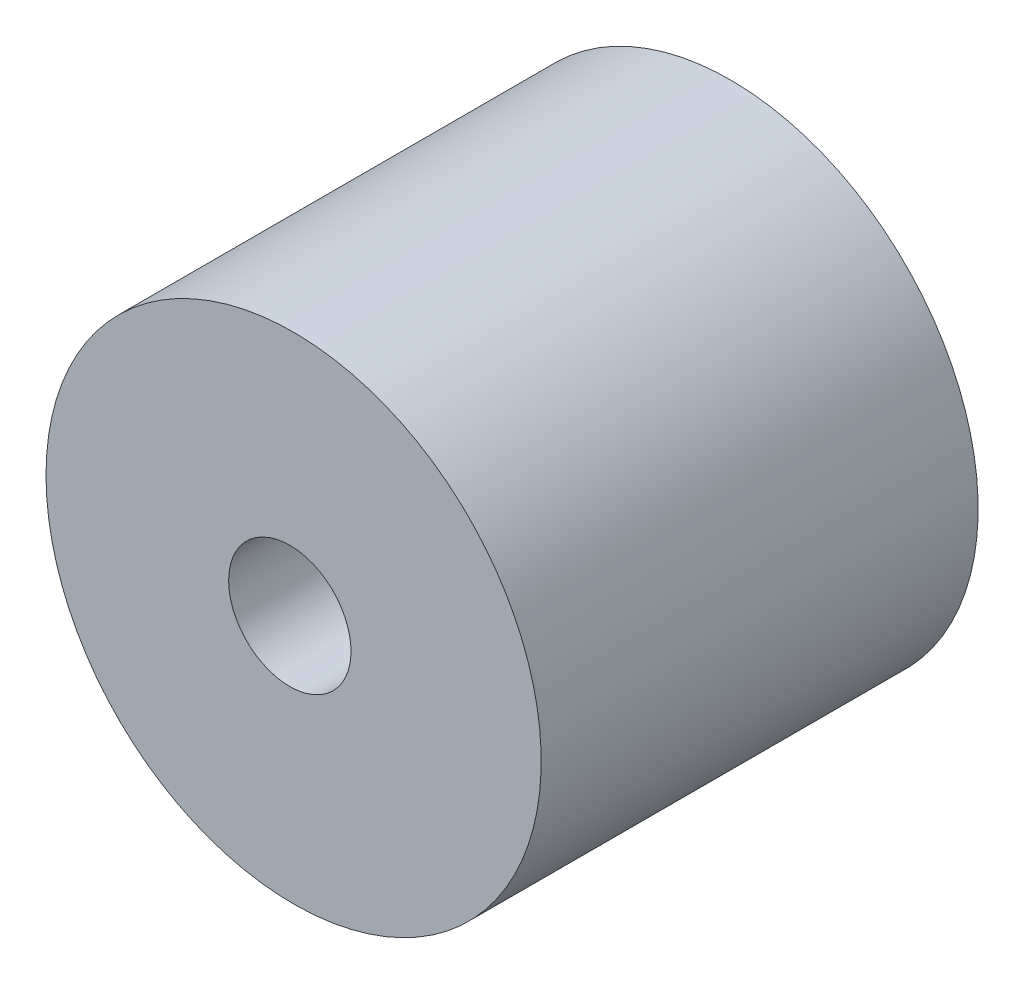
ISO-10303-21;
HEADER;
FILE_DESCRIPTION(('STEP AP214'),'2;1');
FILE_NAME('part.step','',(''),(''),'','','');
FILE_SCHEMA(('AUTOMOTIVE_DESIGN { 1 0 10303 214 1 1 1 1 }'));
ENDSEC;
DATA;
#1=APPLICATION_CONTEXT('core data for automotive mechanical design processes');
#2=APPLICATION_PROTOCOL_DEFINITION('international standard','automotive_design',2000,#1);
#3=PRODUCT_CONTEXT('',#1,'mechanical');
#4=PRODUCT('Part','Part','',(#3));
#5=PRODUCT_RELATED_PRODUCT_CATEGORY('part','',(#4));
#6=PRODUCT_DEFINITION_FORMATION('','',#4);
#7=PRODUCT_DEFINITION_CONTEXT('part definition',#1,'design');
#8=PRODUCT_DEFINITION('design','',#6,#7);
#9=PRODUCT_DEFINITION_SHAPE('','',#8);
#10=(LENGTH_UNIT() NAMED_UNIT(*) SI_UNIT(.MILLI.,.METRE.));
#11=(NAMED_UNIT(*) PLANE_ANGLE_UNIT() SI_UNIT($,.RADIAN.));
#12=(NAMED_UNIT(*) SI_UNIT($,.STERADIAN.) SOLID_ANGLE_UNIT());
#13=UNCERTAINTY_MEASURE_WITH_UNIT(LENGTH_MEASURE(1.E-05),#10,'distance_accuracy_value','');
#14=(GEOMETRIC_REPRESENTATION_CONTEXT(3) GLOBAL_UNCERTAINTY_ASSIGNED_CONTEXT((#13)) GLOBAL_UNIT_ASSIGNED_CONTEXT((#10,
#11,#12)) REPRESENTATION_CONTEXT('',''));
#15=CARTESIAN_POINT('',(0.,0.,0.));
#16=DIRECTION('',(0.,0.,1.));
#17=DIRECTION('',(1.,0.,0.));
#18=AXIS2_PLACEMENT_3D('',#15,#16,#17);
#19=CARTESIAN_POINT('',(0.165429311437038,0.,19.05));
#20=DIRECTION('',(0.,0.,1.));
#21=DIRECTION('',(1.,0.,0.));
#22=AXIS2_PLACEMENT_3D('',#19,#20,#21);
#23=PLANE('',#22);
#24=CARTESIAN_POINT('',(0.165429311437038,0.,19.05));
#25=DIRECTION('',(0.,0.,1.));
#26=DIRECTION('',(1.,0.,0.));
#27=AXIS2_PLACEMENT_3D('',#24,#25,#26);
#28=CIRCLE('',#27,10.795);
#29=CARTESIAN_POINT('',(-10.629570688563,0.,19.05));
#30=VERTEX_POINT('',#29);
#31=EDGE_CURVE('E10',#30,#30,#28,.T.);
#32=ORIENTED_EDGE('',*,*,#31,.T.);
#33=EDGE_LOOP('',(#32));
#34=FACE_BOUND('',#33,.T.);
#35=CARTESIAN_POINT('',(0.,0.,19.05));
#36=DIRECTION('',(0.,0.,1.));
#37=DIRECTION('',(1.,0.,0.));
#38=AXIS2_PLACEMENT_3D('',#35,#36,#37);
#39=CIRCLE('',#38,2.667);
#40=CARTESIAN_POINT('',(-2.667,0.,19.05));
#41=VERTEX_POINT('',#40);
#42=EDGE_CURVE('E46',#41,#41,#39,.T.);
#43=ORIENTED_EDGE('',*,*,#42,.F.);
#44=EDGE_LOOP('',(#43));
#45=FACE_BOUND('',#44,.T.);
#46=ADVANCED_FACE('F35',(#34,#45),#23,.T.);
#47=CARTESIAN_POINT('',(0.165429311437038,0.,0.));
#48=DIRECTION('',(0.,0.,1.));
#49=DIRECTION('',(1.,0.,0.));
#50=AXIS2_PLACEMENT_3D('',#47,#48,#49);
#51=PLANE('',#50);
#52=CARTESIAN_POINT('',(0.165429311437038,0.,0.));
#53=DIRECTION('',(0.,0.,1.));
#54=DIRECTION('',(1.,0.,0.));
#55=AXIS2_PLACEMENT_3D('',#52,#53,#54);
#56=CIRCLE('',#55,10.795);
#57=CARTESIAN_POINT('',(-10.629570688563,0.,0.));
#58=VERTEX_POINT('',#57);
#59=EDGE_CURVE('E39',#58,#58,#56,.T.);
#60=ORIENTED_EDGE('',*,*,#59,.F.);
#61=EDGE_LOOP('',(#60));
#62=FACE_BOUND('',#61,.T.);
#63=CARTESIAN_POINT('',(0.,0.,0.));
#64=DIRECTION('',(0.,0.,1.));
#65=DIRECTION('',(1.,0.,0.));
#66=AXIS2_PLACEMENT_3D('',#63,#64,#65);
#67=CIRCLE('',#66,2.667);
#68=CARTESIAN_POINT('',(-2.667,0.,0.));
#69=VERTEX_POINT('',#68);
#70=EDGE_CURVE('E48',#69,#69,#67,.T.);
#71=ORIENTED_EDGE('',*,*,#70,.T.);
#72=EDGE_LOOP('',(#71));
#73=FACE_BOUND('',#72,.T.);
#74=ADVANCED_FACE('F58',(#62,#73),#51,.F.);
#75=CARTESIAN_POINT('',(0.165429311437038,0.,19.05));
#76=DIRECTION('',(0.,0.,-1.));
#77=DIRECTION('',(-1.,0.,0.));
#78=AXIS2_PLACEMENT_3D('',#75,#76,#77);
#79=CYLINDRICAL_SURFACE('',#78,10.795);
#80=CARTESIAN_POINT('',(-10.629570688563,0.,19.05));
#81=CARTESIAN_POINT('',(-10.629570688563,0.,18.8515625));
#82=CARTESIAN_POINT('',(-10.629570688563,0.,18.653125));
#83=CARTESIAN_POINT('',(-10.629570688563,0.,18.25625));
#84=CARTESIAN_POINT('',(-10.629570688563,0.,18.0578125));
#85=CARTESIAN_POINT('',(-10.629570688563,0.,17.6609375));
#86=CARTESIAN_POINT('',(-10.629570688563,0.,17.4625));
#87=CARTESIAN_POINT('',(-10.629570688563,0.,17.065625));
#88=CARTESIAN_POINT('',(-10.629570688563,0.,16.8671875));
#89=CARTESIAN_POINT('',(-10.629570688563,0.,16.4703125));
#90=CARTESIAN_POINT('',(-10.629570688563,0.,16.271875));
#91=CARTESIAN_POINT('',(-10.629570688563,0.,15.875));
#92=CARTESIAN_POINT('',(-10.629570688563,0.,15.6765625));
#93=CARTESIAN_POINT('',(-10.629570688563,0.,15.2796875));
#94=CARTESIAN_POINT('',(-10.629570688563,0.,15.08125));
#95=CARTESIAN_POINT('',(-10.629570688563,0.,14.684375));
#96=CARTESIAN_POINT('',(-10.629570688563,0.,14.4859375));
#97=CARTESIAN_POINT('',(-10.629570688563,0.,14.0890625));
#98=CARTESIAN_POINT('',(-10.629570688563,0.,13.890625));
#99=CARTESIAN_POINT('',(-10.629570688563,0.,13.49375));
#100=CARTESIAN_POINT('',(-10.629570688563,0.,13.2953125));
#101=CARTESIAN_POINT('',(-10.629570688563,0.,12.8984375));
#102=CARTESIAN_POINT('',(-10.629570688563,0.,12.7));
#103=CARTESIAN_POINT('',(-10.629570688563,0.,12.303125));
#104=CARTESIAN_POINT('',(-10.629570688563,0.,12.1046875));
#105=CARTESIAN_POINT('',(-10.629570688563,0.,11.7078125));
#106=CARTESIAN_POINT('',(-10.629570688563,0.,11.509375));
#107=CARTESIAN_POINT('',(-10.629570688563,0.,11.1125));
#108=CARTESIAN_POINT('',(-10.629570688563,0.,10.9140625));
#109=CARTESIAN_POINT('',(-10.629570688563,0.,10.5171875));
#110=CARTESIAN_POINT('',(-10.629570688563,0.,10.31875));
#111=CARTESIAN_POINT('',(-10.629570688563,0.,9.921875));
#112=CARTESIAN_POINT('',(-10.629570688563,0.,9.7234375));
#113=CARTESIAN_POINT('',(-10.629570688563,0.,9.3265625));
#114=CARTESIAN_POINT('',(-10.629570688563,0.,9.128125));
#115=CARTESIAN_POINT('',(-10.629570688563,0.,8.73125));
#116=CARTESIAN_POINT('',(-10.629570688563,0.,8.5328125));
#117=CARTESIAN_POINT('',(-10.629570688563,0.,8.1359375));
#118=CARTESIAN_POINT('',(-10.629570688563,0.,7.9375));
#119=CARTESIAN_POINT('',(-10.629570688563,0.,7.540625));
#120=CARTESIAN_POINT('',(-10.629570688563,0.,7.3421875));
#121=CARTESIAN_POINT('',(-10.629570688563,0.,6.9453125));
#122=CARTESIAN_POINT('',(-10.629570688563,0.,6.746875));
#123=CARTESIAN_POINT('',(-10.629570688563,0.,6.35));
#124=CARTESIAN_POINT('',(-10.629570688563,0.,6.1515625));
#125=CARTESIAN_POINT('',(-10.629570688563,0.,5.7546875));
#126=CARTESIAN_POINT('',(-10.629570688563,0.,5.55625));
#127=CARTESIAN_POINT('',(-10.629570688563,0.,5.159375));
#128=CARTESIAN_POINT('',(-10.629570688563,0.,4.9609375));
#129=CARTESIAN_POINT('',(-10.629570688563,0.,4.5640625));
#130=CARTESIAN_POINT('',(-10.629570688563,0.,4.365625));
#131=CARTESIAN_POINT('',(-10.629570688563,0.,3.96875));
#132=CARTESIAN_POINT('',(-10.629570688563,0.,3.7703125));
#133=CARTESIAN_POINT('',(-10.629570688563,0.,3.3734375));
#134=CARTESIAN_POINT('',(-10.629570688563,0.,3.175));
#135=CARTESIAN_POINT('',(-10.629570688563,0.,2.778125));
#136=CARTESIAN_POINT('',(-10.629570688563,0.,2.5796875));
#137=CARTESIAN_POINT('',(-10.629570688563,0.,2.1828125));
#138=CARTESIAN_POINT('',(-10.629570688563,0.,1.984375));
#139=CARTESIAN_POINT('',(-10.629570688563,0.,1.5875));
#140=CARTESIAN_POINT('',(-10.629570688563,0.,1.3890625));
#141=CARTESIAN_POINT('',(-10.629570688563,0.,0.992187500000001));
#142=CARTESIAN_POINT('',(-10.629570688563,0.,0.793750000000001));
#143=CARTESIAN_POINT('',(-10.629570688563,0.,0.396875));
#144=CARTESIAN_POINT('',(-10.629570688563,0.,0.1984375));
#145=CARTESIAN_POINT('',(-10.629570688563,0.,0.));
#146=B_SPLINE_CURVE_WITH_KNOTS('',3,(#80,#81,#82,#83,#84,#85,#86,#87,#88,#89,#90,#91,#92,#93,
#94,#95,#96,#97,#98,#99,#100,#101,#102,#103,#104,#105,#106,#107,#108,#109,#110,#111,#112,#113,
#114,#115,#116,#117,#118,#119,#120,#121,#122,#123,#124,#125,#126,#127,#128,#129,#130,#131,#132,
#133,#134,#135,#136,#137,#138,#139,#140,#141,#142,#143,#144,#145),.UNSPECIFIED.,.F.,.F.,(4,2,2,
2,2,2,2,2,2,2,2,2,2,2,2,2,2,2,2,2,2,2,2,2,2,2,2,2,2,2,2,2,4),(0.,0.5953125,1.190625,1.7859375,
2.38125,2.9765625,3.571875,4.1671875,4.7625,5.3578125,5.953125,6.5484375,7.14375,7.7390625,
8.334375,8.9296875,9.525,10.1203125,10.715625,11.3109375,11.90625,12.5015625,13.096875,
13.6921875,14.2875,14.8828125,15.478125,16.0734375,16.66875,17.2640625,17.859375,18.4546875,
19.05),.UNSPECIFIED.);
#147=EDGE_CURVE('BSEAM37',#30,#58,#146,.T.);
#148=ORIENTED_EDGE('',*,*,#31,.F.);
#149=ORIENTED_EDGE('',*,*,#59,.T.);
#150=ORIENTED_EDGE('',*,*,#147,.T.);
#151=ORIENTED_EDGE('',*,*,#147,.F.);
#152=EDGE_LOOP('',(#148,#150,#149,#151));
#153=FACE_BOUND('',#152,.T.);
#154=ADVANCED_FACE('F37',(#153),#79,.T.);
#155=CARTESIAN_POINT('',(0.,0.,19.05));
#156=DIRECTION('',(0.,0.,-1.));
#157=DIRECTION('',(-1.,0.,0.));
#158=AXIS2_PLACEMENT_3D('',#155,#156,#157);
#159=CYLINDRICAL_SURFACE('',#158,2.667);
#160=CARTESIAN_POINT('',(-2.667,0.,19.05));
#161=CARTESIAN_POINT('',(-2.667,0.,18.8515625));
#162=CARTESIAN_POINT('',(-2.667,0.,18.653125));
#163=CARTESIAN_POINT('',(-2.667,0.,18.25625));
#164=CARTESIAN_POINT('',(-2.667,0.,18.0578125));
#165=CARTESIAN_POINT('',(-2.667,0.,17.6609375));
#166=CARTESIAN_POINT('',(-2.667,0.,17.4625));
#167=CARTESIAN_POINT('',(-2.667,0.,17.065625));
#168=CARTESIAN_POINT('',(-2.667,0.,16.8671875));
#169=CARTESIAN_POINT('',(-2.667,0.,16.4703125));
#170=CARTESIAN_POINT('',(-2.667,0.,16.271875));
#171=CARTESIAN_POINT('',(-2.667,0.,15.875));
#172=CARTESIAN_POINT('',(-2.667,0.,15.6765625));
#173=CARTESIAN_POINT('',(-2.667,0.,15.2796875));
#174=CARTESIAN_POINT('',(-2.667,0.,15.08125));
#175=CARTESIAN_POINT('',(-2.667,0.,14.684375));
#176=CARTESIAN_POINT('',(-2.667,0.,14.4859375));
#177=CARTESIAN_POINT('',(-2.667,0.,14.0890625));
#178=CARTESIAN_POINT('',(-2.667,0.,13.890625));
#179=CARTESIAN_POINT('',(-2.667,0.,13.49375));
#180=CARTESIAN_POINT('',(-2.667,0.,13.2953125));
#181=CARTESIAN_POINT('',(-2.667,0.,12.8984375));
#182=CARTESIAN_POINT('',(-2.667,0.,12.7));
#183=CARTESIAN_POINT('',(-2.667,0.,12.303125));
#184=CARTESIAN_POINT('',(-2.667,0.,12.1046875));
#185=CARTESIAN_POINT('',(-2.667,0.,11.7078125));
#186=CARTESIAN_POINT('',(-2.667,0.,11.509375));
#187=CARTESIAN_POINT('',(-2.667,0.,11.1125));
#188=CARTESIAN_POINT('',(-2.667,0.,10.9140625));
#189=CARTESIAN_POINT('',(-2.667,0.,10.5171875));
#190=CARTESIAN_POINT('',(-2.667,0.,10.31875));
#191=CARTESIAN_POINT('',(-2.667,0.,9.921875));
#192=CARTESIAN_POINT('',(-2.667,0.,9.7234375));
#193=CARTESIAN_POINT('',(-2.667,0.,9.3265625));
#194=CARTESIAN_POINT('',(-2.667,0.,9.128125));
#195=CARTESIAN_POINT('',(-2.667,0.,8.73125));
#196=CARTESIAN_POINT('',(-2.667,0.,8.5328125));
#197=CARTESIAN_POINT('',(-2.667,0.,8.1359375));
#198=CARTESIAN_POINT('',(-2.667,0.,7.9375));
#199=CARTESIAN_POINT('',(-2.667,0.,7.540625));
#200=CARTESIAN_POINT('',(-2.667,0.,7.3421875));
#201=CARTESIAN_POINT('',(-2.667,0.,6.9453125));
#202=CARTESIAN_POINT('',(-2.667,0.,6.746875));
#203=CARTESIAN_POINT('',(-2.667,0.,6.35));
#204=CARTESIAN_POINT('',(-2.667,0.,6.1515625));
#205=CARTESIAN_POINT('',(-2.667,0.,5.7546875));
#206=CARTESIAN_POINT('',(-2.667,0.,5.55625));
#207=CARTESIAN_POINT('',(-2.667,0.,5.159375));
#208=CARTESIAN_POINT('',(-2.667,0.,4.9609375));
#209=CARTESIAN_POINT('',(-2.667,0.,4.5640625));
#210=CARTESIAN_POINT('',(-2.667,0.,4.365625));
#211=CARTESIAN_POINT('',(-2.667,0.,3.96875));
#212=CARTESIAN_POINT('',(-2.667,0.,3.7703125));
#213=CARTESIAN_POINT('',(-2.667,0.,3.3734375));
#214=CARTESIAN_POINT('',(-2.667,0.,3.175));
#215=CARTESIAN_POINT('',(-2.667,0.,2.778125));
#216=CARTESIAN_POINT('',(-2.667,0.,2.5796875));
#217=CARTESIAN_POINT('',(-2.667,0.,2.1828125));
#218=CARTESIAN_POINT('',(-2.667,0.,1.984375));
#219=CARTESIAN_POINT('',(-2.667,0.,1.5875));
#220=CARTESIAN_POINT('',(-2.667,0.,1.3890625));
#221=CARTESIAN_POINT('',(-2.667,0.,0.992187500000001));
#222=CARTESIAN_POINT('',(-2.667,0.,0.793750000000001));
#223=CARTESIAN_POINT('',(-2.667,0.,0.396875));
#224=CARTESIAN_POINT('',(-2.667,0.,0.1984375));
#225=CARTESIAN_POINT('',(-2.667,0.,0.));
#226=B_SPLINE_CURVE_WITH_KNOTS('',3,(#160,#161,#162,#163,#164,#165,#166,#167,#168,#169,#170,
#171,#172,#173,#174,#175,#176,#177,#178,#179,#180,#181,#182,#183,#184,#185,#186,#187,#188,#189,
#190,#191,#192,#193,#194,#195,#196,#197,#198,#199,#200,#201,#202,#203,#204,#205,#206,#207,#208,
#209,#210,#211,#212,#213,#214,#215,#216,#217,#218,#219,#220,#221,#222,#223,#224,#225),
.UNSPECIFIED.,.F.,.F.,(4,2,2,2,2,2,2,2,2,2,2,2,2,2,2,2,2,2,2,2,2,2,2,2,2,2,2,2,2,2,2,2,4),(0.,
0.5953125,1.190625,1.7859375,2.38125,2.9765625,3.571875,4.1671875,4.7625,5.3578125,5.953125,
6.5484375,7.14375,7.7390625,8.334375,8.9296875,9.525,10.1203125,10.715625,11.3109375,11.90625,
12.5015625,13.096875,13.6921875,14.2875,14.8828125,15.478125,16.0734375,16.66875,17.2640625,
17.859375,18.4546875,19.05),.UNSPECIFIED.);
#227=EDGE_CURVE('BSEAM54',#41,#69,#226,.T.);
#228=ORIENTED_EDGE('',*,*,#42,.T.);
#229=ORIENTED_EDGE('',*,*,#70,.F.);
#230=ORIENTED_EDGE('',*,*,#227,.T.);
#231=ORIENTED_EDGE('',*,*,#227,.F.);
#232=EDGE_LOOP('',(#228,#230,#229,#231));
#233=FACE_BOUND('',#232,.T.);
#234=ADVANCED_FACE('F54',(#233),#159,.F.);
#235=CLOSED_SHELL('',(#46,#74,#154,#234));
#236=MANIFOLD_SOLID_BREP('B2',#235);
#237=ADVANCED_BREP_SHAPE_REPRESENTATION('',(#18,#236),#14);
#238=SHAPE_DEFINITION_REPRESENTATION(#9,#237);
ENDSEC;
END-ISO-10303-21;
